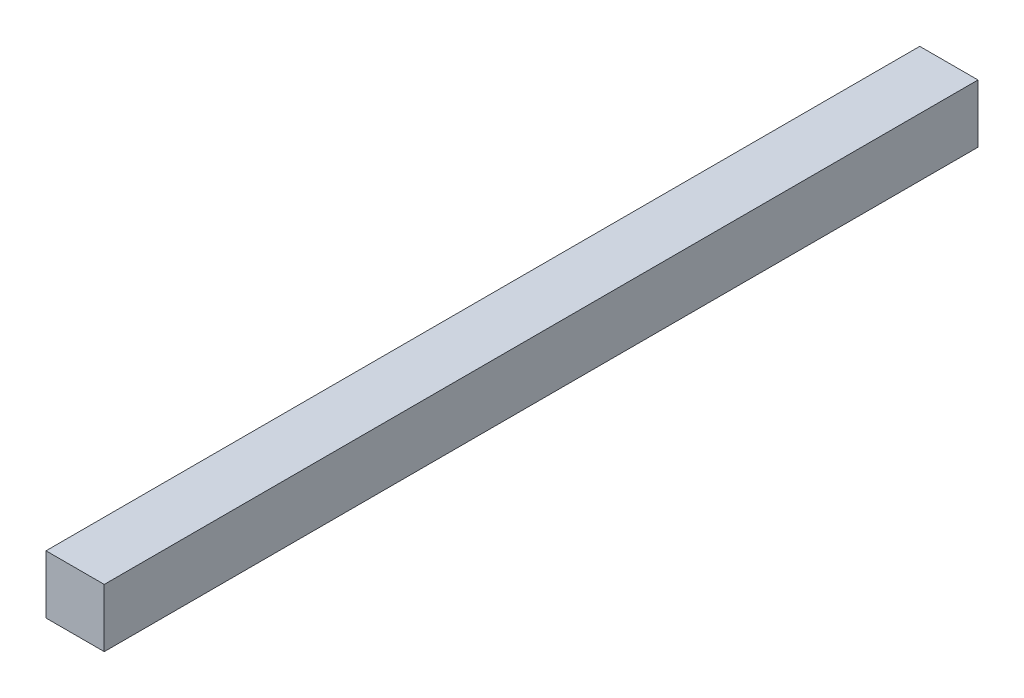
ISO-10303-21;
HEADER;
FILE_DESCRIPTION(('STEP AP214'),'2;1');
FILE_NAME('part.step','',(''),(''),'','','');
FILE_SCHEMA(('AUTOMOTIVE_DESIGN { 1 0 10303 214 1 1 1 1 }'));
ENDSEC;
DATA;
#1=APPLICATION_CONTEXT('core data for automotive mechanical design processes');
#2=APPLICATION_PROTOCOL_DEFINITION('international standard','automotive_design',2000,#1);
#3=PRODUCT_CONTEXT('',#1,'mechanical');
#4=PRODUCT('Part','Part','',(#3));
#5=PRODUCT_RELATED_PRODUCT_CATEGORY('part','',(#4));
#6=PRODUCT_DEFINITION_FORMATION('','',#4);
#7=PRODUCT_DEFINITION_CONTEXT('part definition',#1,'design');
#8=PRODUCT_DEFINITION('design','',#6,#7);
#9=PRODUCT_DEFINITION_SHAPE('','',#8);
#10=(LENGTH_UNIT() NAMED_UNIT(*) SI_UNIT(.MILLI.,.METRE.));
#11=(NAMED_UNIT(*) PLANE_ANGLE_UNIT() SI_UNIT($,.RADIAN.));
#12=(NAMED_UNIT(*) SI_UNIT($,.STERADIAN.) SOLID_ANGLE_UNIT());
#13=UNCERTAINTY_MEASURE_WITH_UNIT(LENGTH_MEASURE(1.E-05),#10,'distance_accuracy_value','');
#14=(GEOMETRIC_REPRESENTATION_CONTEXT(3) GLOBAL_UNCERTAINTY_ASSIGNED_CONTEXT((#13)) GLOBAL_UNIT_ASSIGNED_CONTEXT((#10,
#11,#12)) REPRESENTATION_CONTEXT('',''));
#15=CARTESIAN_POINT('',(0.,0.,0.));
#16=DIRECTION('',(0.,0.,1.));
#17=DIRECTION('',(1.,0.,0.));
#18=AXIS2_PLACEMENT_3D('',#15,#16,#17);
#19=CARTESIAN_POINT('',(-5.,0.,150.));
#20=DIRECTION('',(-1.,0.,0.));
#21=DIRECTION('',(0.,0.,1.));
#22=AXIS2_PLACEMENT_3D('',#19,#20,#21);
#23=PLANE('',#22);
#24=DIRECTION('',(0.,1.,0.));
#25=VECTOR('',#24,1.);
#26=CARTESIAN_POINT('',(-5.,0.,0.));
#27=LINE('',#26,#25);
#28=CARTESIAN_POINT('',(-5.,-5.,0.));
#29=VERTEX_POINT('',#28);
#30=CARTESIAN_POINT('',(-5.,5.,0.));
#31=VERTEX_POINT('',#30);
#32=EDGE_CURVE('E136',#29,#31,#27,.T.);
#33=ORIENTED_EDGE('',*,*,#32,.F.);
#34=DIRECTION('',(0.,0.,-1.));
#35=VECTOR('',#34,1.);
#36=CARTESIAN_POINT('',(-5.,-5.,150.));
#37=LINE('',#36,#35);
#38=CARTESIAN_POINT('',(-5.,-5.,150.));
#39=VERTEX_POINT('',#38);
#40=EDGE_CURVE('E84',#39,#29,#37,.T.);
#41=ORIENTED_EDGE('',*,*,#40,.F.);
#42=DIRECTION('',(0.,1.,0.));
#43=VECTOR('',#42,1.);
#44=CARTESIAN_POINT('',(-5.,0.,150.));
#45=LINE('',#44,#43);
#46=CARTESIAN_POINT('',(-5.,5.,150.));
#47=VERTEX_POINT('',#46);
#48=EDGE_CURVE('E126',#39,#47,#45,.T.);
#49=ORIENTED_EDGE('',*,*,#48,.T.);
#50=DIRECTION('',(0.,0.,-1.));
#51=VECTOR('',#50,1.);
#52=CARTESIAN_POINT('',(-5.,5.,150.));
#53=LINE('',#52,#51);
#54=EDGE_CURVE('E98',#47,#31,#53,.T.);
#55=ORIENTED_EDGE('',*,*,#54,.T.);
#56=EDGE_LOOP('',(#33,#41,#49,#55));
#57=FACE_BOUND('',#56,.T.);
#58=ADVANCED_FACE('F67',(#57),#23,.T.);
#59=CARTESIAN_POINT('',(0.,0.,0.));
#60=DIRECTION('',(0.,0.,1.));
#61=DIRECTION('',(1.,0.,0.));
#62=AXIS2_PLACEMENT_3D('',#59,#60,#61);
#63=PLANE('',#62);
#64=DIRECTION('',(1.,0.,0.));
#65=VECTOR('',#64,1.);
#66=CARTESIAN_POINT('',(0.,-5.,0.));
#67=LINE('',#66,#65);
#68=CARTESIAN_POINT('',(5.,-5.,0.));
#69=VERTEX_POINT('',#68);
#70=EDGE_CURVE('E131',#29,#69,#67,.T.);
#71=ORIENTED_EDGE('',*,*,#70,.F.);
#72=ORIENTED_EDGE('',*,*,#32,.T.);
#73=DIRECTION('',(1.,0.,0.));
#74=VECTOR('',#73,1.);
#75=CARTESIAN_POINT('',(0.,5.,0.));
#76=LINE('',#75,#74);
#77=CARTESIAN_POINT('',(5.,5.,0.));
#78=VERTEX_POINT('',#77);
#79=EDGE_CURVE('E134',#31,#78,#76,.T.);
#80=ORIENTED_EDGE('',*,*,#79,.T.);
#81=DIRECTION('',(0.,1.,0.));
#82=VECTOR('',#81,1.);
#83=CARTESIAN_POINT('',(5.,0.,0.));
#84=LINE('',#83,#82);
#85=EDGE_CURVE('E122',#69,#78,#84,.T.);
#86=ORIENTED_EDGE('',*,*,#85,.F.);
#87=EDGE_LOOP('',(#71,#72,#80,#86));
#88=FACE_BOUND('',#87,.T.);
#89=ADVANCED_FACE('F141',(#88),#63,.F.);
#90=CARTESIAN_POINT('',(0.,5.,150.));
#91=DIRECTION('',(0.,1.,0.));
#92=DIRECTION('',(-1.,0.,0.));
#93=AXIS2_PLACEMENT_3D('',#90,#91,#92);
#94=PLANE('',#93);
#95=ORIENTED_EDGE('',*,*,#79,.F.);
#96=ORIENTED_EDGE('',*,*,#54,.F.);
#97=DIRECTION('',(1.,0.,0.));
#98=VECTOR('',#97,1.);
#99=CARTESIAN_POINT('',(0.,5.,150.));
#100=LINE('',#99,#98);
#101=CARTESIAN_POINT('',(5.,5.,150.));
#102=VERTEX_POINT('',#101);
#103=EDGE_CURVE('E116',#47,#102,#100,.T.);
#104=ORIENTED_EDGE('',*,*,#103,.T.);
#105=DIRECTION('',(0.,0.,-1.));
#106=VECTOR('',#105,1.);
#107=CARTESIAN_POINT('',(5.,5.,150.));
#108=LINE('',#107,#106);
#109=EDGE_CURVE('E76',#102,#78,#108,.T.);
#110=ORIENTED_EDGE('',*,*,#109,.T.);
#111=EDGE_LOOP('',(#95,#96,#104,#110));
#112=FACE_BOUND('',#111,.T.);
#113=ADVANCED_FACE('F125',(#112),#94,.T.);
#114=CARTESIAN_POINT('',(5.,0.,150.));
#115=DIRECTION('',(-1.,0.,0.));
#116=DIRECTION('',(0.,-1.,0.));
#117=AXIS2_PLACEMENT_3D('',#114,#115,#116);
#118=PLANE('',#117);
#119=ORIENTED_EDGE('',*,*,#85,.T.);
#120=ORIENTED_EDGE('',*,*,#109,.F.);
#121=DIRECTION('',(0.,1.,0.));
#122=VECTOR('',#121,1.);
#123=CARTESIAN_POINT('',(5.,0.,150.));
#124=LINE('',#123,#122);
#125=CARTESIAN_POINT('',(5.,-5.,150.));
#126=VERTEX_POINT('',#125);
#127=EDGE_CURVE('E109',#126,#102,#124,.T.);
#128=ORIENTED_EDGE('',*,*,#127,.F.);
#129=DIRECTION('',(0.,0.,-1.));
#130=VECTOR('',#129,1.);
#131=CARTESIAN_POINT('',(5.,-5.,150.));
#132=LINE('',#131,#130);
#133=EDGE_CURVE('E12',#126,#69,#132,.T.);
#134=ORIENTED_EDGE('',*,*,#133,.T.);
#135=EDGE_LOOP('',(#119,#120,#128,#134));
#136=FACE_BOUND('',#135,.T.);
#137=ADVANCED_FACE('F121',(#136),#118,.F.);
#138=CARTESIAN_POINT('',(0.,-5.,150.));
#139=DIRECTION('',(0.,1.,0.));
#140=DIRECTION('',(0.,0.,1.));
#141=AXIS2_PLACEMENT_3D('',#138,#139,#140);
#142=PLANE('',#141);
#143=ORIENTED_EDGE('',*,*,#70,.T.);
#144=ORIENTED_EDGE('',*,*,#133,.F.);
#145=DIRECTION('',(1.,0.,0.));
#146=VECTOR('',#145,1.);
#147=CARTESIAN_POINT('',(0.,-5.,150.));
#148=LINE('',#147,#146);
#149=EDGE_CURVE('E117',#39,#126,#148,.T.);
#150=ORIENTED_EDGE('',*,*,#149,.F.);
#151=ORIENTED_EDGE('',*,*,#40,.T.);
#152=EDGE_LOOP('',(#143,#144,#150,#151));
#153=FACE_BOUND('',#152,.T.);
#154=ADVANCED_FACE('F69',(#153),#142,.F.);
#155=CARTESIAN_POINT('',(0.,0.,150.));
#156=DIRECTION('',(0.,0.,1.));
#157=DIRECTION('',(1.,0.,0.));
#158=AXIS2_PLACEMENT_3D('',#155,#156,#157);
#159=PLANE('',#158);
#160=ORIENTED_EDGE('',*,*,#149,.T.);
#161=ORIENTED_EDGE('',*,*,#127,.T.);
#162=ORIENTED_EDGE('',*,*,#103,.F.);
#163=ORIENTED_EDGE('',*,*,#48,.F.);
#164=EDGE_LOOP('',(#160,#161,#162,#163));
#165=FACE_BOUND('',#164,.T.);
#166=ADVANCED_FACE('F113',(#165),#159,.T.);
#167=CLOSED_SHELL('',(#58,#89,#113,#137,#154,#166));
#168=MANIFOLD_SOLID_BREP('B2',#167);
#169=ADVANCED_BREP_SHAPE_REPRESENTATION('',(#18,#168),#14);
#170=SHAPE_DEFINITION_REPRESENTATION(#9,#169);
ENDSEC;
END-ISO-10303-21;
